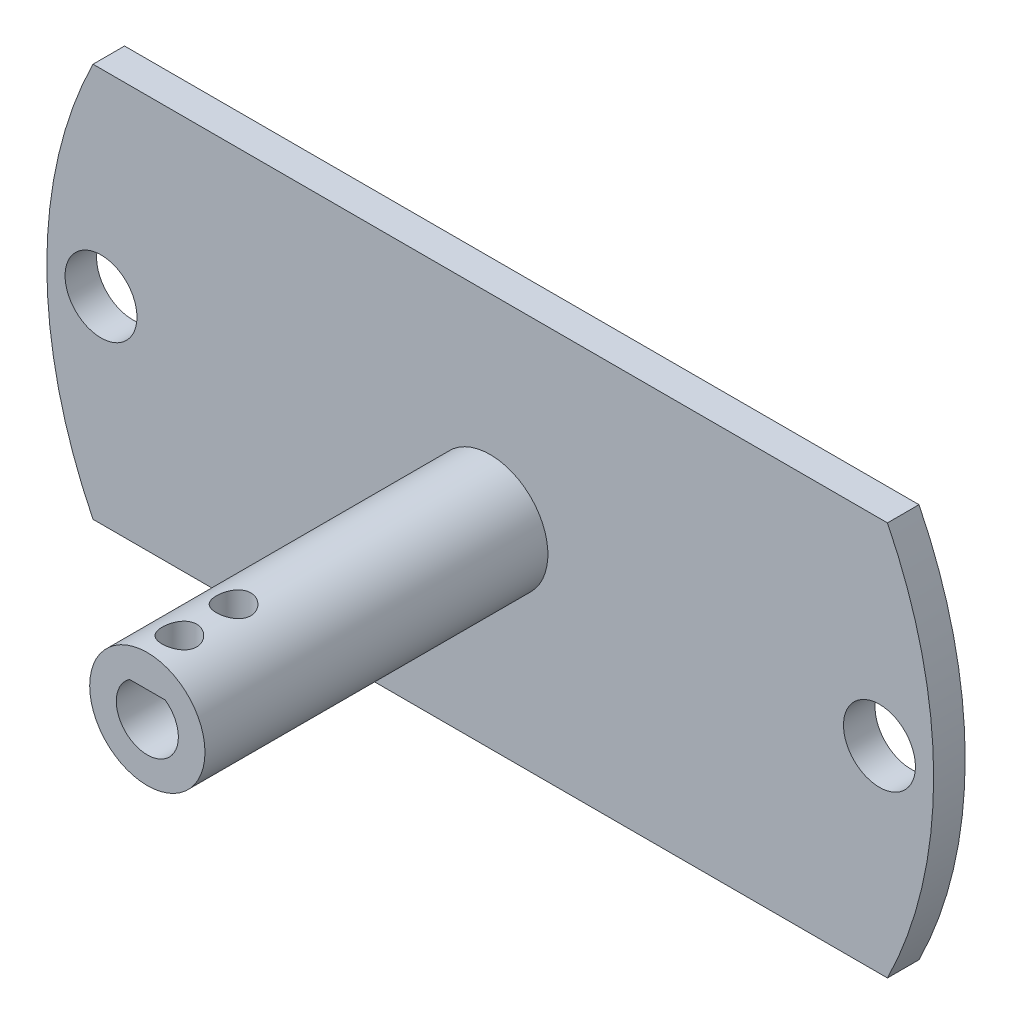
ISO-10303-21;
HEADER;
FILE_DESCRIPTION(('STEP AP214'),'2;1');
FILE_NAME('part.step','',(''),(''),'','','');
FILE_SCHEMA(('AUTOMOTIVE_DESIGN { 1 0 10303 214 1 1 1 1 }'));
ENDSEC;
DATA;
#1=APPLICATION_CONTEXT('core data for automotive mechanical design processes');
#2=APPLICATION_PROTOCOL_DEFINITION('international standard','automotive_design',2000,#1);
#3=PRODUCT_CONTEXT('',#1,'mechanical');
#4=PRODUCT('Part','Part','',(#3));
#5=PRODUCT_RELATED_PRODUCT_CATEGORY('part','',(#4));
#6=PRODUCT_DEFINITION_FORMATION('','',#4);
#7=PRODUCT_DEFINITION_CONTEXT('part definition',#1,'design');
#8=PRODUCT_DEFINITION('design','',#6,#7);
#9=PRODUCT_DEFINITION_SHAPE('','',#8);
#10=(LENGTH_UNIT() NAMED_UNIT(*) SI_UNIT(.MILLI.,.METRE.));
#11=(NAMED_UNIT(*) PLANE_ANGLE_UNIT() SI_UNIT($,.RADIAN.));
#12=(NAMED_UNIT(*) SI_UNIT($,.STERADIAN.) SOLID_ANGLE_UNIT());
#13=UNCERTAINTY_MEASURE_WITH_UNIT(LENGTH_MEASURE(1.E-05),#10,'distance_accuracy_value','');
#14=(GEOMETRIC_REPRESENTATION_CONTEXT(3) GLOBAL_UNCERTAINTY_ASSIGNED_CONTEXT((#13)) GLOBAL_UNIT_ASSIGNED_CONTEXT((#10,
#11,#12)) REPRESENTATION_CONTEXT('',''));
#15=CARTESIAN_POINT('',(0.,0.,0.));
#16=DIRECTION('',(0.,0.,1.));
#17=DIRECTION('',(1.,0.,0.));
#18=AXIS2_PLACEMENT_3D('',#15,#16,#17);
#19=CARTESIAN_POINT('',(0.,0.,3.2));
#20=DIRECTION('',(0.,0.,-1.));
#21=DIRECTION('',(-1.,0.,0.));
#22=AXIS2_PLACEMENT_3D('',#19,#20,#21);
#23=CYLINDRICAL_SURFACE('',#22,45.);
#24=CARTESIAN_POINT('',(0.,0.,0.));
#25=DIRECTION('',(0.,0.,-1.));
#26=DIRECTION('',(-1.,0.,0.));
#27=AXIS2_PLACEMENT_3D('',#24,#25,#26);
#28=CIRCLE('',#27,45.);
#29=CARTESIAN_POINT('',(-40.3112887414928,-20.,0.));
#30=VERTEX_POINT('',#29);
#31=CARTESIAN_POINT('',(-40.3112887414928,20.,0.));
#32=VERTEX_POINT('',#31);
#33=EDGE_CURVE('E101',#30,#32,#28,.T.);
#34=ORIENTED_EDGE('',*,*,#33,.F.);
#35=DIRECTION('',(0.,0.,-1.));
#36=VECTOR('',#35,1.);
#37=CARTESIAN_POINT('',(-40.3112887414928,-20.,3.2));
#38=LINE('',#37,#36);
#39=CARTESIAN_POINT('',(-40.3112887414928,-20.,3.2));
#40=VERTEX_POINT('',#39);
#41=EDGE_CURVE('E54',#30,#40,#38,.F.);
#42=ORIENTED_EDGE('',*,*,#41,.T.);
#43=CARTESIAN_POINT('',(0.,0.,3.2));
#44=DIRECTION('',(0.,0.,-1.));
#45=DIRECTION('',(-1.,0.,0.));
#46=AXIS2_PLACEMENT_3D('',#43,#44,#45);
#47=CIRCLE('',#46,45.);
#48=CARTESIAN_POINT('',(-40.3112887414928,20.,3.2));
#49=VERTEX_POINT('',#48);
#50=EDGE_CURVE('E103',#40,#49,#47,.T.);
#51=ORIENTED_EDGE('',*,*,#50,.T.);
#52=DIRECTION('',(0.,0.,-1.));
#53=VECTOR('',#52,1.);
#54=CARTESIAN_POINT('',(-40.3112887414928,20.,3.2));
#55=LINE('',#54,#53);
#56=EDGE_CURVE('E91',#49,#32,#55,.T.);
#57=ORIENTED_EDGE('',*,*,#56,.T.);
#58=EDGE_LOOP('',(#34,#42,#51,#57));
#59=FACE_BOUND('',#58,.T.);
#60=ADVANCED_FACE('F39',(#59),#23,.T.);
#61=CARTESIAN_POINT('',(40.3112887414928,20.,3.2));
#62=VERTEX_POINT('',#61);
#63=CARTESIAN_POINT('',(40.3112887414927,-20.,3.2));
#64=VERTEX_POINT('',#63);
#65=EDGE_CURVE('E118',#62,#64,#47,.T.);
#66=ORIENTED_EDGE('',*,*,#65,.T.);
#67=DIRECTION('',(0.,0.,-1.));
#68=VECTOR('',#67,1.);
#69=CARTESIAN_POINT('',(40.3112887414927,-20.,3.2));
#70=LINE('',#69,#68);
#71=CARTESIAN_POINT('',(40.3112887414927,-20.,0.));
#72=VERTEX_POINT('',#71);
#73=EDGE_CURVE('E205',#64,#72,#70,.T.);
#74=ORIENTED_EDGE('',*,*,#73,.T.);
#75=CARTESIAN_POINT('',(40.3112887414928,20.,0.));
#76=VERTEX_POINT('',#75);
#77=EDGE_CURVE('E108',#76,#72,#28,.T.);
#78=ORIENTED_EDGE('',*,*,#77,.F.);
#79=DIRECTION('',(0.,0.,-1.));
#80=VECTOR('',#79,1.);
#81=CARTESIAN_POINT('',(40.3112887414928,20.,3.2));
#82=LINE('',#81,#80);
#83=EDGE_CURVE('E62',#76,#62,#82,.F.);
#84=ORIENTED_EDGE('',*,*,#83,.T.);
#85=EDGE_LOOP('',(#66,#74,#78,#84));
#86=FACE_BOUND('',#85,.T.);
#87=ADVANCED_FACE('F173',(#86),#23,.T.);
#88=CARTESIAN_POINT('',(0.,0.,38.));
#89=DIRECTION('',(0.,0.,-1.));
#90=DIRECTION('',(-1.,0.,0.));
#91=AXIS2_PLACEMENT_3D('',#88,#89,#90);
#92=CYLINDRICAL_SURFACE('',#91,5.85);
#93=CARTESIAN_POINT('',(1.75,5.58211429478114,34.75));
#94=CARTESIAN_POINT('',(1.74999877104173,5.58211531082365,34.6540924826106));
#95=CARTESIAN_POINT('',(1.74208897019859,5.58461305332687,34.5581727995072));
#96=CARTESIAN_POINT('',(1.7107396851143,5.59429450831493,34.3691368118833));
#97=CARTESIAN_POINT('',(1.68729494419854,5.6014798069507,34.2760214674418));
#98=CARTESIAN_POINT('',(1.62574232433865,5.61965133430413,34.0953581025735));
#99=CARTESIAN_POINT('',(1.58765872976871,5.63063126508357,34.0078011401597));
#100=CARTESIAN_POINT('',(1.49798915884842,5.65514638232055,33.8402978008161));
#101=CARTESIAN_POINT('',(1.44640118616906,5.66868194649045,33.7603525514977));
#102=CARTESIAN_POINT('',(1.32944929028719,5.6972608866858,33.6078263051362));
#103=CARTESIAN_POINT('',(1.26373457163923,5.71233624673918,33.5355202163412));
#104=CARTESIAN_POINT('',(1.12114641514814,5.74202286573387,33.4027727982201));
#105=CARTESIAN_POINT('',(1.04427155316563,5.75663406515344,33.3423329854615));
#106=CARTESIAN_POINT('',(0.879590985844246,5.78410921043628,33.2338413014433));
#107=CARTESIAN_POINT('',(0.791593108387389,5.79693107755657,33.1860695410652));
#108=CARTESIAN_POINT('',(0.60836414441432,5.81901140244821,33.106108816014));
#109=CARTESIAN_POINT('',(0.513134613618382,5.82827062405342,33.0739165107122));
#110=CARTESIAN_POINT('',(0.321021441726762,5.8419560889313,33.0269377396524));
#111=CARTESIAN_POINT('',(0.224261966986497,5.84651235298426,33.0116820728658));
#112=CARTESIAN_POINT('',(0.0294567567433731,5.85073633260584,32.9975262101977));
#113=CARTESIAN_POINT('',(-0.0685887058064841,5.8504050693062,32.9986225979467));
#114=CARTESIAN_POINT('',(-0.259891749691312,5.84498331491321,33.0168243635483));
#115=CARTESIAN_POINT('',(-0.353202627368488,5.84004387189408,33.0334216670339));
#116=CARTESIAN_POINT('',(-0.535648326968199,5.82614419373454,33.0813244309293));
#117=CARTESIAN_POINT('',(-0.624782884616887,5.81718370452436,33.1126308207385));
#118=CARTESIAN_POINT('',(-0.797555876170451,5.7960395185302,33.1894083154694));
#119=CARTESIAN_POINT('',(-0.881118519583267,5.78381962171541,33.2350395922413));
#120=CARTESIAN_POINT('',(-1.039563331828,5.75745332502841,33.3390449565128));
#121=CARTESIAN_POINT('',(-1.11444344421842,5.74330647047826,33.3974220534359));
#122=CARTESIAN_POINT('',(-1.25642974298125,5.71396057858337,33.5278986734117));
#123=CARTESIAN_POINT('',(-1.32312783003442,5.69874199574186,33.6004384865029));
#124=CARTESIAN_POINT('',(-1.44352746732367,5.66944248852825,33.7558221483396));
#125=CARTESIAN_POINT('',(-1.49722774123483,5.65536167597027,33.8386670077847));
#126=CARTESIAN_POINT('',(-1.59052979642536,5.6298389778579,34.0133784444959));
#127=CARTESIAN_POINT('',(-1.62999299414911,5.6184233947298,34.1053231534945));
#128=CARTESIAN_POINT('',(-1.69275490913382,5.59983611368439,34.2949739884335));
#129=CARTESIAN_POINT('',(-1.71605886435755,5.592663040683,34.3926782362866));
#130=CARTESIAN_POINT('',(-1.74507956501765,5.58367450704387,34.5871924808141));
#131=CARTESIAN_POINT('',(-1.75141634947587,5.58167026486452,34.6839013215954));
#132=CARTESIAN_POINT('',(-1.74805370296958,5.58272445011125,34.877003134659));
#133=CARTESIAN_POINT('',(-1.73835650151823,5.58578217367505,34.9733961489893));
#134=CARTESIAN_POINT('',(-1.70375319599785,5.59643055655954,35.1605492424009));
#135=CARTESIAN_POINT('',(-1.67924571986609,5.6039022954689,35.2513904790603));
#136=CARTESIAN_POINT('',(-1.61617938519103,5.62241381382934,35.4276656595706));
#137=CARTESIAN_POINT('',(-1.57761836552822,5.6334541420198,35.5130987694002));
#138=CARTESIAN_POINT('',(-1.48636127020353,5.65822553347296,35.6786562504901));
#139=CARTESIAN_POINT('',(-1.43331510907684,5.6720205982682,35.758577835665));
#140=CARTESIAN_POINT('',(-1.31500974866876,5.70060928552845,35.908611698784));
#141=CARTESIAN_POINT('',(-1.24974764298716,5.71540314508868,35.9787216354027));
#142=CARTESIAN_POINT('',(-1.10594913379192,5.74499384704159,36.1098504205012));
#143=CARTESIAN_POINT('',(-1.02700675932084,5.7597700027566,36.1704298302117));
#144=CARTESIAN_POINT('',(-0.859725094502567,5.78710156118317,36.2774919652305));
#145=CARTESIAN_POINT('',(-0.771386273069788,5.7996570746291,36.3239753935305));
#146=CARTESIAN_POINT('',(-0.588405321102825,5.8210557887843,36.4010776981731));
#147=CARTESIAN_POINT('',(-0.493816592294539,5.82992665924147,36.4318152409792));
#148=CARTESIAN_POINT('',(-0.300503532683008,5.84307876130665,36.4768583342855));
#149=CARTESIAN_POINT('',(-0.201780386047888,5.84736129787594,36.4911685569383));
#150=CARTESIAN_POINT('',(-0.00706308222179577,5.85077523762072,36.5025971291618));
#151=CARTESIAN_POINT('',(0.0888907785411979,5.85009764792072,36.5003529383705));
#152=CARTESIAN_POINT('',(0.278994909030709,5.84411716630168,36.4802590941604));
#153=CARTESIAN_POINT('',(0.373145279718001,5.83881453407398,36.4624103169229));
#154=CARTESIAN_POINT('',(0.555996510318712,5.82423379368791,36.4120076305248));
#155=CARTESIAN_POINT('',(0.644744639980912,5.81499852048618,36.3796119669396));
#156=CARTESIAN_POINT('',(0.815592359079882,5.79350766478316,36.3011765910212));
#157=CARTESIAN_POINT('',(0.897690856667342,5.78125158760543,36.2551346437693));
#158=CARTESIAN_POINT('',(1.05575195406068,5.75452180955449,36.1490124099479));
#159=CARTESIAN_POINT('',(1.13143568671584,5.739989890458,36.0885315556147));
#160=CARTESIAN_POINT('',(1.27179300512047,5.71053375961208,35.9559707251267));
#161=CARTESIAN_POINT('',(1.33646341679145,5.69560943619611,35.8838874167068));
#162=CARTESIAN_POINT('',(1.4548792462538,5.66653867796539,35.7276083071818));
#163=CARTESIAN_POINT('',(1.50824484611099,5.65242831958016,35.6431172516819));
#164=CARTESIAN_POINT('',(1.59995176029717,5.62716005362783,35.4659551100204));
#165=CARTESIAN_POINT('',(1.63830036845543,5.61600071359345,35.3732880218659));
#166=CARTESIAN_POINT('',(1.6953864371699,5.59901351225531,35.1928504602962));
#167=CARTESIAN_POINT('',(1.71581032605063,5.59273596195868,35.1056532863194));
#168=CARTESIAN_POINT('',(1.74311634261038,5.58428628488875,34.9289739689981));
#169=CARTESIAN_POINT('',(1.75000114675347,5.58211334670154,34.8394922808098));
#170=CARTESIAN_POINT('',(1.75,5.58211429478114,34.75));
#171=B_SPLINE_CURVE_WITH_KNOTS('',3,(#93,#94,#95,#96,#97,#98,#99,#100,#101,#102,#103,#104,#105,
#106,#107,#108,#109,#110,#111,#112,#113,#114,#115,#116,#117,#118,#119,#120,#121,#122,#123,#124,
#125,#126,#127,#128,#129,#130,#131,#132,#133,#134,#135,#136,#137,#138,#139,#140,#141,#142,#143,
#144,#145,#146,#147,#148,#149,#150,#151,#152,#153,#154,#155,#156,#157,#158,#159,#160,#161,#162,
#163,#164,#165,#166,#167,#168,#169,#170),.UNSPECIFIED.,.T.,.F.,(4,2,2,2,2,2,2,2,2,2,2,2,2,2,2,2,
2,2,2,2,2,2,2,2,2,2,2,2,2,2,2,2,2,2,2,2,2,2,4),(0.,0.287392456675484,0.574882210194835,
0.861897091354447,1.14895442541468,1.44419509738725,1.73947347802155,2.04082012321994,
2.34210212342382,2.63481146242323,2.92745964768553,3.21084021121987,3.49423868267465,
3.78092613155385,4.06768134372618,4.36543025331339,4.66320838861077,4.96381150491808,
5.26431713615411,5.55368103221161,5.84300469582983,6.12486779807997,6.40677426284944,
6.69621158111968,6.98571784963601,7.28607920836191,7.58642558506822,7.8844738567628,
8.18243733846766,8.46898877399674,8.75552412099526,9.03901524668908,9.3225528267931,
9.61512497624472,9.90778130385925,10.2090958247868,10.510263813655,10.7784856691939,
11.0466544961587),.UNSPECIFIED.);
#172=CARTESIAN_POINT('',(1.75,5.58211429478114,34.75));
#173=VERTEX_POINT('',#172);
#174=EDGE_CURVE('E134',#173,#173,#171,.T.);
#175=ORIENTED_EDGE('',*,*,#174,.F.);
#176=EDGE_LOOP('',(#175));
#177=FACE_BOUND('',#176,.T.);
#178=CARTESIAN_POINT('',(1.75,5.58211429478114,29.25));
#179=CARTESIAN_POINT('',(1.74999877104173,5.58211531082365,29.1540924826106));
#180=CARTESIAN_POINT('',(1.74208897019859,5.58461305332687,29.0581727995072));
#181=CARTESIAN_POINT('',(1.7107396851143,5.59429450831493,28.8691368118833));
#182=CARTESIAN_POINT('',(1.68729494419854,5.6014798069507,28.7760214674418));
#183=CARTESIAN_POINT('',(1.62574232433865,5.61965133430413,28.5953581025735));
#184=CARTESIAN_POINT('',(1.58765872976871,5.63063126508357,28.5078011401597));
#185=CARTESIAN_POINT('',(1.49798915884842,5.65514638232055,28.3402978008161));
#186=CARTESIAN_POINT('',(1.44640118616906,5.66868194649045,28.2603525514977));
#187=CARTESIAN_POINT('',(1.32944929028719,5.6972608866858,28.1078263051362));
#188=CARTESIAN_POINT('',(1.26373457163923,5.71233624673918,28.0355202163412));
#189=CARTESIAN_POINT('',(1.12114641514814,5.74202286573387,27.9027727982201));
#190=CARTESIAN_POINT('',(1.04427155316563,5.75663406515344,27.8423329854615));
#191=CARTESIAN_POINT('',(0.879590985844246,5.78410921043628,27.7338413014433));
#192=CARTESIAN_POINT('',(0.791593108387388,5.79693107755657,27.6860695410652));
#193=CARTESIAN_POINT('',(0.608364144414319,5.81901140244821,27.606108816014));
#194=CARTESIAN_POINT('',(0.513134613618381,5.82827062405342,27.5739165107122));
#195=CARTESIAN_POINT('',(0.32102144172676,5.8419560889313,27.5269377396524));
#196=CARTESIAN_POINT('',(0.224261966986495,5.84651235298426,27.5116820728658));
#197=CARTESIAN_POINT('',(0.0294567567433713,5.85073633260584,27.4975262101977));
#198=CARTESIAN_POINT('',(-0.068588705806486,5.8504050693062,27.4986225979466));
#199=CARTESIAN_POINT('',(-0.259891749691314,5.84498331491321,27.5168243635483));
#200=CARTESIAN_POINT('',(-0.35320262736849,5.84004387189408,27.5334216670339));
#201=CARTESIAN_POINT('',(-0.5356483269682,5.82614419373454,27.5813244309293));
#202=CARTESIAN_POINT('',(-0.624782884616888,5.81718370452436,27.6126308207385));
#203=CARTESIAN_POINT('',(-0.797555876170452,5.7960395185302,27.6894083154694));
#204=CARTESIAN_POINT('',(-0.881118519583268,5.78381962171541,27.7350395922413));
#205=CARTESIAN_POINT('',(-1.039563331828,5.75745332502841,27.8390449565128));
#206=CARTESIAN_POINT('',(-1.11444344421842,5.74330647047826,27.8974220534359));
#207=CARTESIAN_POINT('',(-1.25642974298125,5.71396057858337,28.0278986734117));
#208=CARTESIAN_POINT('',(-1.32312783003442,5.69874199574186,28.1004384865029));
#209=CARTESIAN_POINT('',(-1.44352746732366,5.66944248852825,28.2558221483396));
#210=CARTESIAN_POINT('',(-1.49722774123482,5.65536167597027,28.3386670077847));
#211=CARTESIAN_POINT('',(-1.59052979642536,5.6298389778579,28.5133784444959));
#212=CARTESIAN_POINT('',(-1.62999299414911,5.6184233947298,28.6053231534945));
#213=CARTESIAN_POINT('',(-1.69275490913382,5.59983611368439,28.7949739884335));
#214=CARTESIAN_POINT('',(-1.71605886435755,5.592663040683,28.8926782362866));
#215=CARTESIAN_POINT('',(-1.74507956501765,5.58367450704387,29.0871924808141));
#216=CARTESIAN_POINT('',(-1.75141634947587,5.58167026486452,29.1839013215954));
#217=CARTESIAN_POINT('',(-1.74805370296958,5.58272445011125,29.377003134659));
#218=CARTESIAN_POINT('',(-1.73835650151823,5.58578217367505,29.4733961489893));
#219=CARTESIAN_POINT('',(-1.70375319599785,5.59643055655954,29.6605492424009));
#220=CARTESIAN_POINT('',(-1.67924571986609,5.6039022954689,29.7513904790603));
#221=CARTESIAN_POINT('',(-1.61617938519103,5.62241381382934,29.9276656595706));
#222=CARTESIAN_POINT('',(-1.57761836552822,5.6334541420198,30.0130987694001));
#223=CARTESIAN_POINT('',(-1.48636127020353,5.65822553347295,30.1786562504901));
#224=CARTESIAN_POINT('',(-1.43331510907684,5.6720205982682,30.258577835665));
#225=CARTESIAN_POINT('',(-1.31500974866876,5.70060928552845,30.4086116987839));
#226=CARTESIAN_POINT('',(-1.24974764298716,5.71540314508868,30.4787216354027));
#227=CARTESIAN_POINT('',(-1.10594913379192,5.74499384704159,30.6098504205012));
#228=CARTESIAN_POINT('',(-1.02700675932083,5.7597700027566,30.6704298302117));
#229=CARTESIAN_POINT('',(-0.859725094502561,5.78710156118317,30.7774919652305));
#230=CARTESIAN_POINT('',(-0.771386273069786,5.7996570746291,30.8239753935305));
#231=CARTESIAN_POINT('',(-0.588405321102828,5.82105578878429,30.9010776981731));
#232=CARTESIAN_POINT('',(-0.493816592294543,5.82992665924147,30.9318152409792));
#233=CARTESIAN_POINT('',(-0.300503532683012,5.84307876130665,30.9768583342855));
#234=CARTESIAN_POINT('',(-0.201780386047892,5.84736129787594,30.9911685569383));
#235=CARTESIAN_POINT('',(-0.00706308222179857,5.85077523762072,31.0025971291618));
#236=CARTESIAN_POINT('',(0.0888907785411956,5.85009764792072,31.0003529383705));
#237=CARTESIAN_POINT('',(0.278994909030708,5.84411716630168,30.9802590941604));
#238=CARTESIAN_POINT('',(0.373145279718001,5.83881453407398,30.9624103169229));
#239=CARTESIAN_POINT('',(0.555996510318711,5.82423379368791,30.9120076305248));
#240=CARTESIAN_POINT('',(0.64474463998091,5.81499852048618,30.8796119669396));
#241=CARTESIAN_POINT('',(0.81559235907988,5.79350766478316,30.8011765910212));
#242=CARTESIAN_POINT('',(0.897690856667342,5.78125158760543,30.7551346437693));
#243=CARTESIAN_POINT('',(1.05575195406068,5.75452180955449,30.6490124099479));
#244=CARTESIAN_POINT('',(1.13143568671583,5.739989890458,30.5885315556147));
#245=CARTESIAN_POINT('',(1.27179300512047,5.71053375961208,30.4559707251267));
#246=CARTESIAN_POINT('',(1.33646341679145,5.69560943619611,30.3838874167068));
#247=CARTESIAN_POINT('',(1.4548792462538,5.66653867796539,30.2276083071818));
#248=CARTESIAN_POINT('',(1.50824484611099,5.65242831958016,30.1431172516819));
#249=CARTESIAN_POINT('',(1.59995176029717,5.62716005362783,29.9659551100204));
#250=CARTESIAN_POINT('',(1.63830036845543,5.61600071359345,29.8732880218658));
#251=CARTESIAN_POINT('',(1.6953864371699,5.59901351225531,29.6928504602962));
#252=CARTESIAN_POINT('',(1.71581032605063,5.59273596195869,29.6056532863194));
#253=CARTESIAN_POINT('',(1.74311634261038,5.58428628488875,29.4289739689981));
#254=CARTESIAN_POINT('',(1.75000114675347,5.58211334670154,29.3394922808098));
#255=CARTESIAN_POINT('',(1.75,5.58211429478114,29.25));
#256=B_SPLINE_CURVE_WITH_KNOTS('',3,(#178,#179,#180,#181,#182,#183,#184,#185,#186,#187,#188,
#189,#190,#191,#192,#193,#194,#195,#196,#197,#198,#199,#200,#201,#202,#203,#204,#205,#206,#207,
#208,#209,#210,#211,#212,#213,#214,#215,#216,#217,#218,#219,#220,#221,#222,#223,#224,#225,#226,
#227,#228,#229,#230,#231,#232,#233,#234,#235,#236,#237,#238,#239,#240,#241,#242,#243,#244,#245,
#246,#247,#248,#249,#250,#251,#252,#253,#254,#255),.UNSPECIFIED.,.T.,.F.,(4,2,2,2,2,2,2,2,2,2,2,
2,2,2,2,2,2,2,2,2,2,2,2,2,2,2,2,2,2,2,2,2,2,2,2,2,2,2,4),(0.,0.28739245667548,0.574882210194835,
0.86189709135445,1.14895442541469,1.44419509738724,1.73947347802155,2.04082012321994,
2.34210212342382,2.63481146242323,2.92745964768553,3.21084021121987,3.49423868267465,
3.78092613155385,4.06768134372618,4.36543025331339,4.66320838861076,4.96381150491808,
5.26431713615411,5.5536810322116,5.84300469582983,6.12486779807997,6.40677426284943,
6.69621158111968,6.98571784963602,7.28607920836192,7.58642558506822,7.88447385676279,
8.18243733846765,8.46898877399674,8.75552412099526,9.03901524668908,9.3225528267931,
9.61512497624472,9.90778130385925,10.2090958247868,10.510263813655,10.7784856691939,
11.0466544961587),.UNSPECIFIED.);
#257=CARTESIAN_POINT('',(1.75,5.58211429478114,29.25));
#258=VERTEX_POINT('',#257);
#259=EDGE_CURVE('E125',#258,#258,#256,.T.);
#260=ORIENTED_EDGE('',*,*,#259,.F.);
#261=EDGE_LOOP('',(#260));
#262=FACE_BOUND('',#261,.T.);
#263=CARTESIAN_POINT('',(0.,0.,38.));
#264=DIRECTION('',(0.,0.,1.));
#265=DIRECTION('',(1.,0.,0.));
#266=AXIS2_PLACEMENT_3D('',#263,#264,#265);
#267=CIRCLE('',#266,5.85);
#268=CARTESIAN_POINT('',(5.85,0.,38.));
#269=VERTEX_POINT('',#268);
#270=EDGE_CURVE('E229',#269,#269,#267,.T.);
#271=ORIENTED_EDGE('',*,*,#270,.F.);
#272=EDGE_LOOP('',(#271));
#273=FACE_BOUND('',#272,.T.);
#274=CARTESIAN_POINT('',(0.,0.,3.2));
#275=DIRECTION('',(0.,0.,-1.));
#276=DIRECTION('',(-1.,0.,0.));
#277=AXIS2_PLACEMENT_3D('',#274,#275,#276);
#278=CIRCLE('',#277,5.85);
#279=CARTESIAN_POINT('',(-5.85,0.,3.2));
#280=VERTEX_POINT('',#279);
#281=EDGE_CURVE('E97',#280,#280,#278,.T.);
#282=ORIENTED_EDGE('',*,*,#281,.F.);
#283=EDGE_LOOP('',(#282));
#284=FACE_BOUND('',#283,.T.);
#285=ADVANCED_FACE('F41',(#177,#262,#273,#284),#92,.T.);
#286=CARTESIAN_POINT('',(0.,0.,38.));
#287=DIRECTION('',(0.,0.,-1.));
#288=DIRECTION('',(-1.,0.,0.));
#289=AXIS2_PLACEMENT_3D('',#286,#287,#288);
#290=CYLINDRICAL_SURFACE('',#289,3.15);
#291=DIRECTION('',(0.,0.,-1.));
#292=VECTOR('',#291,1.);
#293=CARTESIAN_POINT('',(1.8,2.58505319094211,38.));
#294=LINE('',#293,#292);
#295=CARTESIAN_POINT('',(1.8,2.58505319094211,38.));
#296=VERTEX_POINT('',#295);
#297=CARTESIAN_POINT('',(1.8,2.58505319094211,3.2));
#298=VERTEX_POINT('',#297);
#299=EDGE_CURVE('E230',#296,#298,#294,.T.);
#300=ORIENTED_EDGE('',*,*,#299,.T.);
#301=CARTESIAN_POINT('',(0.,0.,3.2));
#302=DIRECTION('',(0.,0.,-1.));
#303=DIRECTION('',(-1.,0.,0.));
#304=AXIS2_PLACEMENT_3D('',#301,#302,#303);
#305=CIRCLE('',#304,3.15);
#306=CARTESIAN_POINT('',(-1.8,2.58505319094211,3.2));
#307=VERTEX_POINT('',#306);
#308=EDGE_CURVE('E114',#298,#307,#305,.T.);
#309=ORIENTED_EDGE('',*,*,#308,.T.);
#310=DIRECTION('',(0.,0.,-1.));
#311=VECTOR('',#310,1.);
#312=CARTESIAN_POINT('',(-1.8,2.58505319094211,38.));
#313=LINE('',#312,#311);
#314=CARTESIAN_POINT('',(-1.8,2.58505319094211,38.));
#315=VERTEX_POINT('',#314);
#316=EDGE_CURVE('E235',#315,#307,#313,.T.);
#317=ORIENTED_EDGE('',*,*,#316,.F.);
#318=CARTESIAN_POINT('',(0.,0.,38.));
#319=DIRECTION('',(0.,0.,1.));
#320=DIRECTION('',(1.,0.,0.));
#321=AXIS2_PLACEMENT_3D('',#318,#319,#320);
#322=CIRCLE('',#321,3.15);
#323=EDGE_CURVE('E247',#315,#296,#322,.T.);
#324=ORIENTED_EDGE('',*,*,#323,.T.);
#325=EDGE_LOOP('',(#300,#309,#317,#324));
#326=FACE_BOUND('',#325,.T.);
#327=ADVANCED_FACE('F152',(#326),#290,.F.);
#328=CARTESIAN_POINT('',(-1.8,2.58505319094211,38.));
#329=DIRECTION('',(0.,-1.,0.));
#330=DIRECTION('',(1.,0.,0.));
#331=AXIS2_PLACEMENT_3D('',#328,#329,#330);
#332=PLANE('',#331);
#333=CARTESIAN_POINT('',(0.,2.58505319094211,34.75));
#334=DIRECTION('',(0.,1.,0.));
#335=DIRECTION('',(-1.,0.,0.));
#336=AXIS2_PLACEMENT_3D('',#333,#334,#335);
#337=CIRCLE('',#336,1.75);
#338=CARTESIAN_POINT('',(-1.75,2.58505319094211,34.75));
#339=VERTEX_POINT('',#338);
#340=EDGE_CURVE('E122',#339,#339,#337,.T.);
#341=ORIENTED_EDGE('',*,*,#340,.T.);
#342=EDGE_LOOP('',(#341));
#343=FACE_BOUND('',#342,.T.);
#344=CARTESIAN_POINT('',(0.,2.58505319094211,29.25));
#345=DIRECTION('',(0.,1.,0.));
#346=DIRECTION('',(-1.,0.,0.));
#347=AXIS2_PLACEMENT_3D('',#344,#345,#346);
#348=CIRCLE('',#347,1.75);
#349=CARTESIAN_POINT('',(-1.75,2.58505319094211,29.25));
#350=VERTEX_POINT('',#349);
#351=EDGE_CURVE('E117',#350,#350,#348,.T.);
#352=ORIENTED_EDGE('',*,*,#351,.T.);
#353=EDGE_LOOP('',(#352));
#354=FACE_BOUND('',#353,.T.);
#355=ORIENTED_EDGE('',*,*,#316,.T.);
#356=DIRECTION('',(1.,0.,0.));
#357=VECTOR('',#356,1.);
#358=CARTESIAN_POINT('',(-1.8,2.58505319094211,3.2));
#359=LINE('',#358,#357);
#360=EDGE_CURVE('E121',#307,#298,#359,.T.);
#361=ORIENTED_EDGE('',*,*,#360,.T.);
#362=ORIENTED_EDGE('',*,*,#299,.F.);
#363=DIRECTION('',(-1.,0.,0.));
#364=VECTOR('',#363,1.);
#365=CARTESIAN_POINT('',(-1.8,2.58505319094211,38.));
#366=LINE('',#365,#364);
#367=EDGE_CURVE('E246',#296,#315,#366,.T.);
#368=ORIENTED_EDGE('',*,*,#367,.T.);
#369=EDGE_LOOP('',(#355,#361,#362,#368));
#370=FACE_BOUND('',#369,.T.);
#371=ADVANCED_FACE('F149',(#343,#354,#370),#332,.T.);
#372=CARTESIAN_POINT('',(0.,0.,38.));
#373=DIRECTION('',(0.,0.,1.));
#374=DIRECTION('',(1.,0.,0.));
#375=AXIS2_PLACEMENT_3D('',#372,#373,#374);
#376=PLANE('',#375);
#377=ORIENTED_EDGE('',*,*,#270,.T.);
#378=EDGE_LOOP('',(#377));
#379=FACE_BOUND('',#378,.T.);
#380=ORIENTED_EDGE('',*,*,#367,.F.);
#381=ORIENTED_EDGE('',*,*,#323,.F.);
#382=EDGE_LOOP('',(#380,#381));
#383=FACE_BOUND('',#382,.T.);
#384=ADVANCED_FACE('F145',(#379,#383),#376,.T.);
#385=CARTESIAN_POINT('',(0.,10.0850531909421,29.25));
#386=DIRECTION('',(0.,-1.,0.));
#387=DIRECTION('',(1.,0.,0.));
#388=AXIS2_PLACEMENT_3D('',#385,#386,#387);
#389=CYLINDRICAL_SURFACE('',#388,1.75);
#390=ORIENTED_EDGE('',*,*,#351,.F.);
#391=EDGE_LOOP('',(#390));
#392=FACE_BOUND('',#391,.T.);
#393=ORIENTED_EDGE('',*,*,#259,.T.);
#394=EDGE_LOOP('',(#393));
#395=FACE_BOUND('',#394,.T.);
#396=ADVANCED_FACE('F140',(#392,#395),#389,.F.);
#397=CARTESIAN_POINT('',(0.,10.0850531909421,34.75));
#398=DIRECTION('',(0.,-1.,0.));
#399=DIRECTION('',(1.,0.,0.));
#400=AXIS2_PLACEMENT_3D('',#397,#398,#399);
#401=CYLINDRICAL_SURFACE('',#400,1.75);
#402=ORIENTED_EDGE('',*,*,#340,.F.);
#403=EDGE_LOOP('',(#402));
#404=FACE_BOUND('',#403,.T.);
#405=ORIENTED_EDGE('',*,*,#174,.T.);
#406=EDGE_LOOP('',(#405));
#407=FACE_BOUND('',#406,.T.);
#408=ADVANCED_FACE('F144',(#404,#407),#401,.F.);
#409=CARTESIAN_POINT('',(0.,0.,3.2));
#410=DIRECTION('',(0.,0.,-1.));
#411=DIRECTION('',(-1.,0.,0.));
#412=AXIS2_PLACEMENT_3D('',#409,#410,#411);
#413=PLANE('',#412);
#414=ORIENTED_EDGE('',*,*,#308,.F.);
#415=ORIENTED_EDGE('',*,*,#360,.F.);
#416=EDGE_LOOP('',(#414,#415));
#417=FACE_BOUND('',#416,.T.);
#418=ADVANCED_FACE('F169',(#417),#413,.F.);
#419=DIRECTION('',(-1.,0.,0.));
#420=VECTOR('',#419,1.);
#421=CARTESIAN_POINT('',(0.,-20.,3.2));
#422=LINE('',#421,#420);
#423=EDGE_CURVE('E109',#64,#40,#422,.T.);
#424=ORIENTED_EDGE('',*,*,#423,.F.);
#425=ORIENTED_EDGE('',*,*,#65,.F.);
#426=DIRECTION('',(1.,0.,0.));
#427=VECTOR('',#426,1.);
#428=CARTESIAN_POINT('',(0.,20.,3.2));
#429=LINE('',#428,#427);
#430=EDGE_CURVE('E203',#49,#62,#429,.T.);
#431=ORIENTED_EDGE('',*,*,#430,.F.);
#432=ORIENTED_EDGE('',*,*,#50,.F.);
#433=EDGE_LOOP('',(#424,#425,#431,#432));
#434=FACE_BOUND('',#433,.T.);
#435=CARTESIAN_POINT('',(-39.5,0.,3.2));
#436=DIRECTION('',(0.,0.,-1.));
#437=DIRECTION('',(-1.,0.,0.));
#438=AXIS2_PLACEMENT_3D('',#435,#436,#437);
#439=CIRCLE('',#438,3.65);
#440=CARTESIAN_POINT('',(-35.85,0.,3.2));
#441=VERTEX_POINT('',#440);
#442=EDGE_CURVE('E104',#441,#441,#439,.F.);
#443=ORIENTED_EDGE('',*,*,#442,.F.);
#444=EDGE_LOOP('',(#443));
#445=FACE_BOUND('',#444,.T.);
#446=CARTESIAN_POINT('',(39.5,0.,3.2));
#447=DIRECTION('',(0.,0.,-1.));
#448=DIRECTION('',(-1.,0.,0.));
#449=AXIS2_PLACEMENT_3D('',#446,#447,#448);
#450=CIRCLE('',#449,3.65);
#451=CARTESIAN_POINT('',(43.15,0.,3.2));
#452=VERTEX_POINT('',#451);
#453=EDGE_CURVE('E198',#452,#452,#450,.F.);
#454=ORIENTED_EDGE('',*,*,#453,.F.);
#455=EDGE_LOOP('',(#454));
#456=FACE_BOUND('',#455,.T.);
#457=ORIENTED_EDGE('',*,*,#281,.T.);
#458=EDGE_LOOP('',(#457));
#459=FACE_BOUND('',#458,.T.);
#460=ADVANCED_FACE('F161',(#434,#445,#456,#459),#413,.F.);
#461=CARTESIAN_POINT('',(0.,0.,0.));
#462=DIRECTION('',(0.,0.,1.));
#463=DIRECTION('',(1.,0.,0.));
#464=AXIS2_PLACEMENT_3D('',#461,#462,#463);
#465=PLANE('',#464);
#466=DIRECTION('',(1.,0.,0.));
#467=VECTOR('',#466,1.);
#468=CARTESIAN_POINT('',(0.,-20.,0.));
#469=LINE('',#468,#467);
#470=EDGE_CURVE('E11',#30,#72,#469,.T.);
#471=ORIENTED_EDGE('',*,*,#470,.F.);
#472=ORIENTED_EDGE('',*,*,#33,.T.);
#473=DIRECTION('',(-1.,0.,0.));
#474=VECTOR('',#473,1.);
#475=CARTESIAN_POINT('',(0.,20.,0.));
#476=LINE('',#475,#474);
#477=EDGE_CURVE('E48',#76,#32,#476,.T.);
#478=ORIENTED_EDGE('',*,*,#477,.F.);
#479=ORIENTED_EDGE('',*,*,#77,.T.);
#480=EDGE_LOOP('',(#471,#472,#478,#479));
#481=FACE_BOUND('',#480,.T.);
#482=CARTESIAN_POINT('',(-39.5,0.,0.));
#483=DIRECTION('',(0.,0.,1.));
#484=DIRECTION('',(1.,0.,0.));
#485=AXIS2_PLACEMENT_3D('',#482,#483,#484);
#486=CIRCLE('',#485,3.65);
#487=CARTESIAN_POINT('',(-35.85,0.,0.));
#488=VERTEX_POINT('',#487);
#489=EDGE_CURVE('E193',#488,#488,#486,.F.);
#490=ORIENTED_EDGE('',*,*,#489,.F.);
#491=EDGE_LOOP('',(#490));
#492=FACE_BOUND('',#491,.T.);
#493=CARTESIAN_POINT('',(39.5,0.,0.));
#494=DIRECTION('',(0.,0.,1.));
#495=DIRECTION('',(1.,0.,0.));
#496=AXIS2_PLACEMENT_3D('',#493,#494,#495);
#497=CIRCLE('',#496,3.65);
#498=CARTESIAN_POINT('',(43.15,0.,0.));
#499=VERTEX_POINT('',#498);
#500=EDGE_CURVE('E239',#499,#499,#497,.F.);
#501=ORIENTED_EDGE('',*,*,#500,.F.);
#502=EDGE_LOOP('',(#501));
#503=FACE_BOUND('',#502,.T.);
#504=ADVANCED_FACE('F106',(#481,#492,#503),#465,.F.);
#505=CARTESIAN_POINT('',(39.5,0.,-1.2E-05));
#506=DIRECTION('',(0.,0.,1.));
#507=DIRECTION('',(1.,0.,0.));
#508=AXIS2_PLACEMENT_3D('',#505,#506,#507);
#509=CYLINDRICAL_SURFACE('',#508,3.65);
#510=CARTESIAN_POINT('',(43.15,0.,0.));
#511=CARTESIAN_POINT('',(43.15,0.,0.0333333333333334));
#512=CARTESIAN_POINT('',(43.15,0.,0.0666666666666667));
#513=CARTESIAN_POINT('',(43.15,0.,0.133333333333333));
#514=CARTESIAN_POINT('',(43.15,0.,0.166666666666667));
#515=CARTESIAN_POINT('',(43.15,0.,0.233333333333333));
#516=CARTESIAN_POINT('',(43.15,0.,0.266666666666667));
#517=CARTESIAN_POINT('',(43.15,0.,0.333333333333333));
#518=CARTESIAN_POINT('',(43.15,0.,0.366666666666667));
#519=CARTESIAN_POINT('',(43.15,0.,0.433333333333333));
#520=CARTESIAN_POINT('',(43.15,0.,0.466666666666667));
#521=CARTESIAN_POINT('',(43.15,0.,0.533333333333333));
#522=CARTESIAN_POINT('',(43.15,0.,0.566666666666667));
#523=CARTESIAN_POINT('',(43.15,0.,0.633333333333333));
#524=CARTESIAN_POINT('',(43.15,0.,0.666666666666667));
#525=CARTESIAN_POINT('',(43.15,0.,0.733333333333334));
#526=CARTESIAN_POINT('',(43.15,0.,0.766666666666667));
#527=CARTESIAN_POINT('',(43.15,0.,0.833333333333333));
#528=CARTESIAN_POINT('',(43.15,0.,0.866666666666667));
#529=CARTESIAN_POINT('',(43.15,0.,0.933333333333333));
#530=CARTESIAN_POINT('',(43.15,0.,0.966666666666667));
#531=CARTESIAN_POINT('',(43.15,0.,1.03333333333333));
#532=CARTESIAN_POINT('',(43.15,0.,1.06666666666667));
#533=CARTESIAN_POINT('',(43.15,0.,1.13333333333333));
#534=CARTESIAN_POINT('',(43.15,0.,1.16666666666667));
#535=CARTESIAN_POINT('',(43.15,0.,1.23333333333333));
#536=CARTESIAN_POINT('',(43.15,0.,1.26666666666667));
#537=CARTESIAN_POINT('',(43.15,0.,1.33333333333333));
#538=CARTESIAN_POINT('',(43.15,0.,1.36666666666667));
#539=CARTESIAN_POINT('',(43.15,0.,1.43333333333333));
#540=CARTESIAN_POINT('',(43.15,0.,1.46666666666667));
#541=CARTESIAN_POINT('',(43.15,0.,1.53333333333333));
#542=CARTESIAN_POINT('',(43.15,0.,1.56666666666667));
#543=CARTESIAN_POINT('',(43.15,0.,1.63333333333333));
#544=CARTESIAN_POINT('',(43.15,0.,1.66666666666667));
#545=CARTESIAN_POINT('',(43.15,0.,1.73333333333333));
#546=CARTESIAN_POINT('',(43.15,0.,1.76666666666667));
#547=CARTESIAN_POINT('',(43.15,0.,1.83333333333333));
#548=CARTESIAN_POINT('',(43.15,0.,1.86666666666667));
#549=CARTESIAN_POINT('',(43.15,0.,1.93333333333333));
#550=CARTESIAN_POINT('',(43.15,0.,1.96666666666667));
#551=CARTESIAN_POINT('',(43.15,0.,2.03333333333333));
#552=CARTESIAN_POINT('',(43.15,0.,2.06666666666667));
#553=CARTESIAN_POINT('',(43.15,0.,2.13333333333333));
#554=CARTESIAN_POINT('',(43.15,0.,2.16666666666667));
#555=CARTESIAN_POINT('',(43.15,0.,2.23333333333333));
#556=CARTESIAN_POINT('',(43.15,0.,2.26666666666667));
#557=CARTESIAN_POINT('',(43.15,0.,2.33333333333333));
#558=CARTESIAN_POINT('',(43.15,0.,2.36666666666667));
#559=CARTESIAN_POINT('',(43.15,0.,2.43333333333333));
#560=CARTESIAN_POINT('',(43.15,0.,2.46666666666667));
#561=CARTESIAN_POINT('',(43.15,0.,2.53333333333333));
#562=CARTESIAN_POINT('',(43.15,0.,2.56666666666667));
#563=CARTESIAN_POINT('',(43.15,0.,2.63333333333333));
#564=CARTESIAN_POINT('',(43.15,0.,2.66666666666667));
#565=CARTESIAN_POINT('',(43.15,0.,2.73333333333333));
#566=CARTESIAN_POINT('',(43.15,0.,2.76666666666667));
#567=CARTESIAN_POINT('',(43.15,0.,2.83333333333333));
#568=CARTESIAN_POINT('',(43.15,0.,2.86666666666667));
#569=CARTESIAN_POINT('',(43.15,0.,2.93333333333333));
#570=CARTESIAN_POINT('',(43.15,0.,2.96666666666667));
#571=CARTESIAN_POINT('',(43.15,0.,3.03333333333333));
#572=CARTESIAN_POINT('',(43.15,0.,3.06666666666667));
#573=CARTESIAN_POINT('',(43.15,0.,3.13333333333333));
#574=CARTESIAN_POINT('',(43.15,0.,3.16666666666667));
#575=CARTESIAN_POINT('',(43.15,0.,3.2));
#576=B_SPLINE_CURVE_WITH_KNOTS('',3,(#510,#511,#512,#513,#514,#515,#516,#517,#518,#519,#520,
#521,#522,#523,#524,#525,#526,#527,#528,#529,#530,#531,#532,#533,#534,#535,#536,#537,#538,#539,
#540,#541,#542,#543,#544,#545,#546,#547,#548,#549,#550,#551,#552,#553,#554,#555,#556,#557,#558,
#559,#560,#561,#562,#563,#564,#565,#566,#567,#568,#569,#570,#571,#572,#573,#574,#575),
.UNSPECIFIED.,.F.,.F.,(4,2,2,2,2,2,2,2,2,2,2,2,2,2,2,2,2,2,2,2,2,2,2,2,2,2,2,2,2,2,2,2,4),(0.,
0.1,0.2,0.3,0.4,0.5,0.6,0.7,0.8,0.9,1.,1.1,1.2,1.3,1.4,1.5,1.6,1.7,1.8,1.9,2.,2.1,2.2,2.3,2.4,
2.5,2.6,2.7,2.8,2.9,3.,3.1,3.2),.UNSPECIFIED.);
#577=EDGE_CURVE('BSEAM160',#499,#452,#576,.T.);
#578=ORIENTED_EDGE('',*,*,#500,.T.);
#579=ORIENTED_EDGE('',*,*,#453,.T.);
#580=ORIENTED_EDGE('',*,*,#577,.T.);
#581=ORIENTED_EDGE('',*,*,#577,.F.);
#582=EDGE_LOOP('',(#578,#580,#579,#581));
#583=FACE_BOUND('',#582,.T.);
#584=ADVANCED_FACE('F160',(#583),#509,.F.);
#585=CARTESIAN_POINT('',(-39.5,0.,-1.2E-05));
#586=DIRECTION('',(0.,0.,1.));
#587=DIRECTION('',(1.,0.,0.));
#588=AXIS2_PLACEMENT_3D('',#585,#586,#587);
#589=CYLINDRICAL_SURFACE('',#588,3.65);
#590=CARTESIAN_POINT('',(-35.85,0.,0.));
#591=CARTESIAN_POINT('',(-35.85,0.,0.0333333333333334));
#592=CARTESIAN_POINT('',(-35.85,0.,0.0666666666666667));
#593=CARTESIAN_POINT('',(-35.85,0.,0.133333333333333));
#594=CARTESIAN_POINT('',(-35.85,0.,0.166666666666667));
#595=CARTESIAN_POINT('',(-35.85,0.,0.233333333333333));
#596=CARTESIAN_POINT('',(-35.85,0.,0.266666666666667));
#597=CARTESIAN_POINT('',(-35.85,0.,0.333333333333333));
#598=CARTESIAN_POINT('',(-35.85,0.,0.366666666666667));
#599=CARTESIAN_POINT('',(-35.85,0.,0.433333333333333));
#600=CARTESIAN_POINT('',(-35.85,0.,0.466666666666667));
#601=CARTESIAN_POINT('',(-35.85,0.,0.533333333333333));
#602=CARTESIAN_POINT('',(-35.85,0.,0.566666666666667));
#603=CARTESIAN_POINT('',(-35.85,0.,0.633333333333333));
#604=CARTESIAN_POINT('',(-35.85,0.,0.666666666666667));
#605=CARTESIAN_POINT('',(-35.85,0.,0.733333333333334));
#606=CARTESIAN_POINT('',(-35.85,0.,0.766666666666667));
#607=CARTESIAN_POINT('',(-35.85,0.,0.833333333333333));
#608=CARTESIAN_POINT('',(-35.85,0.,0.866666666666667));
#609=CARTESIAN_POINT('',(-35.85,0.,0.933333333333333));
#610=CARTESIAN_POINT('',(-35.85,0.,0.966666666666667));
#611=CARTESIAN_POINT('',(-35.85,0.,1.03333333333333));
#612=CARTESIAN_POINT('',(-35.85,0.,1.06666666666667));
#613=CARTESIAN_POINT('',(-35.85,0.,1.13333333333333));
#614=CARTESIAN_POINT('',(-35.85,0.,1.16666666666667));
#615=CARTESIAN_POINT('',(-35.85,0.,1.23333333333333));
#616=CARTESIAN_POINT('',(-35.85,0.,1.26666666666667));
#617=CARTESIAN_POINT('',(-35.85,0.,1.33333333333333));
#618=CARTESIAN_POINT('',(-35.85,0.,1.36666666666667));
#619=CARTESIAN_POINT('',(-35.85,0.,1.43333333333333));
#620=CARTESIAN_POINT('',(-35.85,0.,1.46666666666667));
#621=CARTESIAN_POINT('',(-35.85,0.,1.53333333333333));
#622=CARTESIAN_POINT('',(-35.85,0.,1.56666666666667));
#623=CARTESIAN_POINT('',(-35.85,0.,1.63333333333333));
#624=CARTESIAN_POINT('',(-35.85,0.,1.66666666666667));
#625=CARTESIAN_POINT('',(-35.85,0.,1.73333333333333));
#626=CARTESIAN_POINT('',(-35.85,0.,1.76666666666667));
#627=CARTESIAN_POINT('',(-35.85,0.,1.83333333333333));
#628=CARTESIAN_POINT('',(-35.85,0.,1.86666666666667));
#629=CARTESIAN_POINT('',(-35.85,0.,1.93333333333333));
#630=CARTESIAN_POINT('',(-35.85,0.,1.96666666666667));
#631=CARTESIAN_POINT('',(-35.85,0.,2.03333333333333));
#632=CARTESIAN_POINT('',(-35.85,0.,2.06666666666667));
#633=CARTESIAN_POINT('',(-35.85,0.,2.13333333333333));
#634=CARTESIAN_POINT('',(-35.85,0.,2.16666666666667));
#635=CARTESIAN_POINT('',(-35.85,0.,2.23333333333333));
#636=CARTESIAN_POINT('',(-35.85,0.,2.26666666666667));
#637=CARTESIAN_POINT('',(-35.85,0.,2.33333333333333));
#638=CARTESIAN_POINT('',(-35.85,0.,2.36666666666667));
#639=CARTESIAN_POINT('',(-35.85,0.,2.43333333333333));
#640=CARTESIAN_POINT('',(-35.85,0.,2.46666666666667));
#641=CARTESIAN_POINT('',(-35.85,0.,2.53333333333333));
#642=CARTESIAN_POINT('',(-35.85,0.,2.56666666666667));
#643=CARTESIAN_POINT('',(-35.85,0.,2.63333333333333));
#644=CARTESIAN_POINT('',(-35.85,0.,2.66666666666667));
#645=CARTESIAN_POINT('',(-35.85,0.,2.73333333333333));
#646=CARTESIAN_POINT('',(-35.85,0.,2.76666666666667));
#647=CARTESIAN_POINT('',(-35.85,0.,2.83333333333333));
#648=CARTESIAN_POINT('',(-35.85,0.,2.86666666666667));
#649=CARTESIAN_POINT('',(-35.85,0.,2.93333333333333));
#650=CARTESIAN_POINT('',(-35.85,0.,2.96666666666667));
#651=CARTESIAN_POINT('',(-35.85,0.,3.03333333333333));
#652=CARTESIAN_POINT('',(-35.85,0.,3.06666666666667));
#653=CARTESIAN_POINT('',(-35.85,0.,3.13333333333333));
#654=CARTESIAN_POINT('',(-35.85,0.,3.16666666666667));
#655=CARTESIAN_POINT('',(-35.85,0.,3.2));
#656=B_SPLINE_CURVE_WITH_KNOTS('',3,(#590,#591,#592,#593,#594,#595,#596,#597,#598,#599,#600,
#601,#602,#603,#604,#605,#606,#607,#608,#609,#610,#611,#612,#613,#614,#615,#616,#617,#618,#619,
#620,#621,#622,#623,#624,#625,#626,#627,#628,#629,#630,#631,#632,#633,#634,#635,#636,#637,#638,
#639,#640,#641,#642,#643,#644,#645,#646,#647,#648,#649,#650,#651,#652,#653,#654,#655),
.UNSPECIFIED.,.F.,.F.,(4,2,2,2,2,2,2,2,2,2,2,2,2,2,2,2,2,2,2,2,2,2,2,2,2,2,2,2,2,2,2,2,4),(0.,
0.1,0.2,0.3,0.4,0.5,0.6,0.7,0.8,0.9,1.,1.1,1.2,1.3,1.4,1.5,1.6,1.7,1.8,1.9,2.,2.1,2.2,2.3,2.4,
2.5,2.6,2.7,2.8,2.9,3.,3.1,3.2),.UNSPECIFIED.);
#657=EDGE_CURVE('BSEAM166',#488,#441,#656,.T.);
#658=ORIENTED_EDGE('',*,*,#489,.T.);
#659=ORIENTED_EDGE('',*,*,#442,.T.);
#660=ORIENTED_EDGE('',*,*,#657,.T.);
#661=ORIENTED_EDGE('',*,*,#657,.F.);
#662=EDGE_LOOP('',(#658,#660,#659,#661));
#663=FACE_BOUND('',#662,.T.);
#664=ADVANCED_FACE('F166',(#663),#589,.F.);
#665=CARTESIAN_POINT('',(-75.,20.,-1.2E-05));
#666=DIRECTION('',(0.,1.,0.));
#667=DIRECTION('',(-1.,0.,0.));
#668=AXIS2_PLACEMENT_3D('',#665,#666,#667);
#669=PLANE('',#668);
#670=ORIENTED_EDGE('',*,*,#430,.T.);
#671=ORIENTED_EDGE('',*,*,#83,.F.);
#672=ORIENTED_EDGE('',*,*,#477,.T.);
#673=ORIENTED_EDGE('',*,*,#56,.F.);
#674=EDGE_LOOP('',(#670,#671,#672,#673));
#675=FACE_BOUND('',#674,.T.);
#676=ADVANCED_FACE('F90',(#675),#669,.T.);
#677=CARTESIAN_POINT('',(0.,-20.,-1.2E-05));
#678=DIRECTION('',(0.,-1.,0.));
#679=DIRECTION('',(1.,0.,0.));
#680=AXIS2_PLACEMENT_3D('',#677,#678,#679);
#681=PLANE('',#680);
#682=ORIENTED_EDGE('',*,*,#423,.T.);
#683=ORIENTED_EDGE('',*,*,#41,.F.);
#684=ORIENTED_EDGE('',*,*,#470,.T.);
#685=ORIENTED_EDGE('',*,*,#73,.F.);
#686=EDGE_LOOP('',(#682,#683,#684,#685));
#687=FACE_BOUND('',#686,.T.);
#688=ADVANCED_FACE('F181',(#687),#681,.T.);
#689=CLOSED_SHELL('',(#60,#87,#285,#327,#371,#384,#396,#408,#418,#460,#504,#584,#664,#676,#688));
#690=MANIFOLD_SOLID_BREP('B2',#689);
#691=ADVANCED_BREP_SHAPE_REPRESENTATION('',(#18,#690),#14);
#692=SHAPE_DEFINITION_REPRESENTATION(#9,#691);
ENDSEC;
END-ISO-10303-21;
